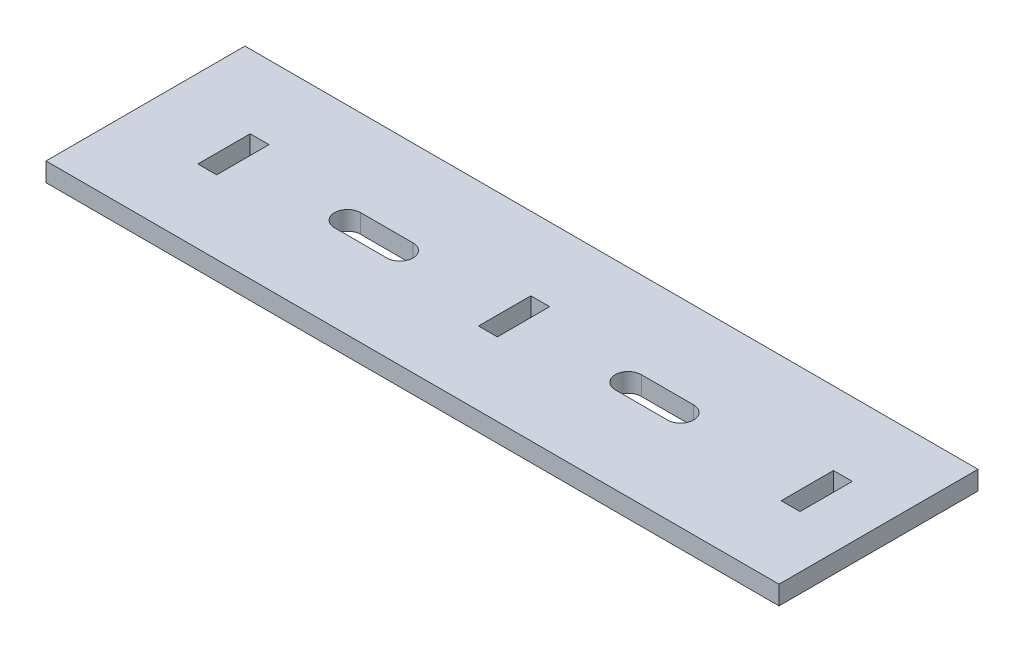
ISO-10303-21;
HEADER;
FILE_DESCRIPTION(('STEP AP214'),'2;1');
FILE_NAME('part.step','',(''),(''),'','','');
FILE_SCHEMA(('AUTOMOTIVE_DESIGN { 1 0 10303 214 1 1 1 1 }'));
ENDSEC;
DATA;
#1=APPLICATION_CONTEXT('core data for automotive mechanical design processes');
#2=APPLICATION_PROTOCOL_DEFINITION('international standard','automotive_design',2000,#1);
#3=PRODUCT_CONTEXT('',#1,'mechanical');
#4=PRODUCT('Part','Part','',(#3));
#5=PRODUCT_RELATED_PRODUCT_CATEGORY('part','',(#4));
#6=PRODUCT_DEFINITION_FORMATION('','',#4);
#7=PRODUCT_DEFINITION_CONTEXT('part definition',#1,'design');
#8=PRODUCT_DEFINITION('design','',#6,#7);
#9=PRODUCT_DEFINITION_SHAPE('','',#8);
#10=(LENGTH_UNIT() NAMED_UNIT(*) SI_UNIT(.MILLI.,.METRE.));
#11=(NAMED_UNIT(*) PLANE_ANGLE_UNIT() SI_UNIT($,.RADIAN.));
#12=(NAMED_UNIT(*) SI_UNIT($,.STERADIAN.) SOLID_ANGLE_UNIT());
#13=UNCERTAINTY_MEASURE_WITH_UNIT(LENGTH_MEASURE(1.E-05),#10,'distance_accuracy_value','');
#14=(GEOMETRIC_REPRESENTATION_CONTEXT(3) GLOBAL_UNCERTAINTY_ASSIGNED_CONTEXT((#13)) GLOBAL_UNIT_ASSIGNED_CONTEXT((#10,
#11,#12)) REPRESENTATION_CONTEXT('',''));
#15=CARTESIAN_POINT('',(0.,0.,0.));
#16=DIRECTION('',(0.,0.,1.));
#17=DIRECTION('',(1.,0.,0.));
#18=AXIS2_PLACEMENT_3D('',#15,#16,#17);
#19=CARTESIAN_POINT('',(0.,4.572,0.));
#20=DIRECTION('',(0.,-1.,0.));
#21=DIRECTION('',(0.,0.,-1.));
#22=AXIS2_PLACEMENT_3D('',#19,#20,#21);
#23=PLANE('',#22);
#24=DIRECTION('',(1.,0.,0.));
#25=VECTOR('',#24,1.);
#26=CARTESIAN_POINT('',(49.022,4.572,-20.955));
#27=LINE('',#26,#25);
#28=CARTESIAN_POINT('',(49.022,4.572,-20.955));
#29=VERTEX_POINT('',#28);
#30=CARTESIAN_POINT('',(61.722,4.572,-20.955));
#31=VERTEX_POINT('',#30);
#32=EDGE_CURVE('E223',#29,#31,#27,.T.);
#33=ORIENTED_EDGE('',*,*,#32,.F.);
#34=CARTESIAN_POINT('',(49.022,4.572,-24.13));
#35=DIRECTION('',(0.,1.,0.));
#36=DIRECTION('',(0.,0.,1.));
#37=AXIS2_PLACEMENT_3D('',#34,#35,#36);
#38=CIRCLE('',#37,3.175);
#39=CARTESIAN_POINT('',(49.022,4.572,-27.305));
#40=VERTEX_POINT('',#39);
#41=EDGE_CURVE('E60',#40,#29,#38,.T.);
#42=ORIENTED_EDGE('',*,*,#41,.F.);
#43=DIRECTION('',(-1.,0.,0.));
#44=VECTOR('',#43,1.);
#45=CARTESIAN_POINT('',(49.022,4.572,-27.305));
#46=LINE('',#45,#44);
#47=CARTESIAN_POINT('',(61.722,4.572,-27.305));
#48=VERTEX_POINT('',#47);
#49=EDGE_CURVE('E230',#48,#40,#46,.T.);
#50=ORIENTED_EDGE('',*,*,#49,.F.);
#51=CARTESIAN_POINT('',(61.722,4.572,-24.13));
#52=DIRECTION('',(0.,1.,0.));
#53=DIRECTION('',(0.,0.,1.));
#54=AXIS2_PLACEMENT_3D('',#51,#52,#53);
#55=CIRCLE('',#54,3.175);
#56=EDGE_CURVE('E212',#31,#48,#55,.T.);
#57=ORIENTED_EDGE('',*,*,#56,.F.);
#58=EDGE_LOOP('',(#33,#42,#50,#57));
#59=FACE_BOUND('',#58,.T.);
#60=DIRECTION('',(1.,0.,0.));
#61=VECTOR('',#60,1.);
#62=CARTESIAN_POINT('',(117.094,4.572,-20.955));
#63=LINE('',#62,#61);
#64=CARTESIAN_POINT('',(117.094,4.572,-20.955));
#65=VERTEX_POINT('',#64);
#66=CARTESIAN_POINT('',(129.794,4.572,-20.955));
#67=VERTEX_POINT('',#66);
#68=EDGE_CURVE('E265',#65,#67,#63,.T.);
#69=ORIENTED_EDGE('',*,*,#68,.F.);
#70=CARTESIAN_POINT('',(117.094,4.572,-24.13));
#71=DIRECTION('',(0.,1.,0.));
#72=DIRECTION('',(0.,0.,1.));
#73=AXIS2_PLACEMENT_3D('',#70,#71,#72);
#74=CIRCLE('',#73,3.175);
#75=CARTESIAN_POINT('',(117.094,4.572,-27.305));
#76=VERTEX_POINT('',#75);
#77=EDGE_CURVE('E68',#76,#65,#74,.T.);
#78=ORIENTED_EDGE('',*,*,#77,.F.);
#79=DIRECTION('',(-1.,0.,0.));
#80=VECTOR('',#79,1.);
#81=CARTESIAN_POINT('',(117.094,4.572,-27.305));
#82=LINE('',#81,#80);
#83=CARTESIAN_POINT('',(129.794000000001,4.572,-27.305));
#84=VERTEX_POINT('',#83);
#85=EDGE_CURVE('E248',#84,#76,#82,.T.);
#86=ORIENTED_EDGE('',*,*,#85,.F.);
#87=CARTESIAN_POINT('',(129.794,4.572,-24.13));
#88=DIRECTION('',(0.,1.,0.));
#89=DIRECTION('',(0.,0.,1.));
#90=AXIS2_PLACEMENT_3D('',#87,#88,#89);
#91=CIRCLE('',#90,3.175);
#92=EDGE_CURVE('E261',#67,#84,#91,.T.);
#93=ORIENTED_EDGE('',*,*,#92,.F.);
#94=EDGE_LOOP('',(#69,#78,#86,#93));
#95=FACE_BOUND('',#94,.T.);
#96=DIRECTION('',(0.,0.,-1.));
#97=VECTOR('',#96,1.);
#98=CARTESIAN_POINT('',(91.694,4.572,-17.78));
#99=LINE('',#98,#97);
#100=CARTESIAN_POINT('',(91.694,4.572,-17.78));
#101=VERTEX_POINT('',#100);
#102=CARTESIAN_POINT('',(91.694,4.572,-30.48));
#103=VERTEX_POINT('',#102);
#104=EDGE_CURVE('E314',#101,#103,#99,.T.);
#105=ORIENTED_EDGE('',*,*,#104,.F.);
#106=DIRECTION('',(1.,0.,0.));
#107=VECTOR('',#106,1.);
#108=CARTESIAN_POINT('',(91.694,4.572,-17.78));
#109=LINE('',#108,#107);
#110=CARTESIAN_POINT('',(87.122,4.572,-17.78));
#111=VERTEX_POINT('',#110);
#112=EDGE_CURVE('E325',#111,#101,#109,.T.);
#113=ORIENTED_EDGE('',*,*,#112,.F.);
#114=DIRECTION('',(0.,0.,1.));
#115=VECTOR('',#114,1.);
#116=CARTESIAN_POINT('',(87.122,4.572,-17.78));
#117=LINE('',#116,#115);
#118=CARTESIAN_POINT('',(87.122,4.572,-30.48));
#119=VERTEX_POINT('',#118);
#120=EDGE_CURVE('E321',#119,#111,#117,.T.);
#121=ORIENTED_EDGE('',*,*,#120,.F.);
#122=DIRECTION('',(-1.,0.,0.));
#123=VECTOR('',#122,1.);
#124=CARTESIAN_POINT('',(91.694,4.572,-30.48));
#125=LINE('',#124,#123);
#126=EDGE_CURVE('E317',#103,#119,#125,.T.);
#127=ORIENTED_EDGE('',*,*,#126,.F.);
#128=EDGE_LOOP('',(#105,#113,#121,#127));
#129=FACE_BOUND('',#128,.T.);
#130=DIRECTION('',(0.,0.,1.));
#131=VECTOR('',#130,1.);
#132=CARTESIAN_POINT('',(0.,4.572,0.));
#133=LINE('',#132,#131);
#134=CARTESIAN_POINT('',(0.,4.572,-48.26));
#135=VERTEX_POINT('',#134);
#136=CARTESIAN_POINT('',(0.,4.572,0.));
#137=VERTEX_POINT('',#136);
#138=EDGE_CURVE('E400',#135,#137,#133,.T.);
#139=ORIENTED_EDGE('',*,*,#138,.T.);
#140=DIRECTION('',(1.,0.,0.));
#141=VECTOR('',#140,1.);
#142=CARTESIAN_POINT('',(0.,4.572,0.));
#143=LINE('',#142,#141);
#144=CARTESIAN_POINT('',(177.8,4.572,0.));
#145=VERTEX_POINT('',#144);
#146=EDGE_CURVE('E404',#137,#145,#143,.T.);
#147=ORIENTED_EDGE('',*,*,#146,.T.);
#148=DIRECTION('',(0.,0.,-1.));
#149=VECTOR('',#148,1.);
#150=CARTESIAN_POINT('',(177.8,4.572,0.));
#151=LINE('',#150,#149);
#152=CARTESIAN_POINT('',(177.8,4.572,-48.26));
#153=VERTEX_POINT('',#152);
#154=EDGE_CURVE('E408',#145,#153,#151,.T.);
#155=ORIENTED_EDGE('',*,*,#154,.T.);
#156=DIRECTION('',(-1.,0.,0.));
#157=VECTOR('',#156,1.);
#158=CARTESIAN_POINT('',(0.,4.572,-48.26));
#159=LINE('',#158,#157);
#160=EDGE_CURVE('E411',#153,#135,#159,.T.);
#161=ORIENTED_EDGE('',*,*,#160,.T.);
#162=EDGE_LOOP('',(#139,#147,#155,#161));
#163=FACE_BOUND('',#162,.T.);
#164=DIRECTION('',(0.,0.,-1.));
#165=VECTOR('',#164,1.);
#166=CARTESIAN_POINT('',(165.1,4.572,-17.78));
#167=LINE('',#166,#165);
#168=CARTESIAN_POINT('',(165.1,4.572,-17.78));
#169=VERTEX_POINT('',#168);
#170=CARTESIAN_POINT('',(165.1,4.572,-30.48));
#171=VERTEX_POINT('',#170);
#172=EDGE_CURVE('E357',#169,#171,#167,.T.);
#173=ORIENTED_EDGE('',*,*,#172,.F.);
#174=DIRECTION('',(1.,0.,0.));
#175=VECTOR('',#174,1.);
#176=CARTESIAN_POINT('',(165.1,4.572,-17.78));
#177=LINE('',#176,#175);
#178=CARTESIAN_POINT('',(160.528,4.572,-17.78));
#179=VERTEX_POINT('',#178);
#180=EDGE_CURVE('E368',#179,#169,#177,.T.);
#181=ORIENTED_EDGE('',*,*,#180,.F.);
#182=DIRECTION('',(0.,0.,1.));
#183=VECTOR('',#182,1.);
#184=CARTESIAN_POINT('',(160.528,4.572,-17.78));
#185=LINE('',#184,#183);
#186=CARTESIAN_POINT('',(160.528,4.572,-30.48));
#187=VERTEX_POINT('',#186);
#188=EDGE_CURVE('E364',#187,#179,#185,.T.);
#189=ORIENTED_EDGE('',*,*,#188,.F.);
#190=DIRECTION('',(-1.,0.,0.));
#191=VECTOR('',#190,1.);
#192=CARTESIAN_POINT('',(165.1,4.572,-30.48));
#193=LINE('',#192,#191);
#194=EDGE_CURVE('E360',#171,#187,#193,.T.);
#195=ORIENTED_EDGE('',*,*,#194,.F.);
#196=EDGE_LOOP('',(#173,#181,#189,#195));
#197=FACE_BOUND('',#196,.T.);
#198=DIRECTION('',(0.,0.,-1.));
#199=VECTOR('',#198,1.);
#200=CARTESIAN_POINT('',(23.622,4.572,-17.78));
#201=LINE('',#200,#199);
#202=CARTESIAN_POINT('',(23.622,4.572,-17.78));
#203=VERTEX_POINT('',#202);
#204=CARTESIAN_POINT('',(23.622,4.572,-30.48));
#205=VERTEX_POINT('',#204);
#206=EDGE_CURVE('E271',#203,#205,#201,.T.);
#207=ORIENTED_EDGE('',*,*,#206,.F.);
#208=DIRECTION('',(1.,0.,0.));
#209=VECTOR('',#208,1.);
#210=CARTESIAN_POINT('',(23.622,4.572,-17.78));
#211=LINE('',#210,#209);
#212=CARTESIAN_POINT('',(19.05,4.572,-17.78));
#213=VERTEX_POINT('',#212);
#214=EDGE_CURVE('E282',#213,#203,#211,.T.);
#215=ORIENTED_EDGE('',*,*,#214,.F.);
#216=DIRECTION('',(0.,0.,1.));
#217=VECTOR('',#216,1.);
#218=CARTESIAN_POINT('',(19.05,4.572,-17.78));
#219=LINE('',#218,#217);
#220=CARTESIAN_POINT('',(19.05,4.572,-30.48));
#221=VERTEX_POINT('',#220);
#222=EDGE_CURVE('E278',#221,#213,#219,.T.);
#223=ORIENTED_EDGE('',*,*,#222,.F.);
#224=DIRECTION('',(-1.,0.,0.));
#225=VECTOR('',#224,1.);
#226=CARTESIAN_POINT('',(23.622,4.572,-30.48));
#227=LINE('',#226,#225);
#228=EDGE_CURVE('E274',#205,#221,#227,.T.);
#229=ORIENTED_EDGE('',*,*,#228,.F.);
#230=EDGE_LOOP('',(#207,#215,#223,#229));
#231=FACE_BOUND('',#230,.T.);
#232=ADVANCED_FACE('F44',(#59,#95,#129,#163,#197,#231),#23,.F.);
#233=CARTESIAN_POINT('',(0.,0.,0.));
#234=DIRECTION('',(0.,-1.,0.));
#235=DIRECTION('',(0.,0.,-1.));
#236=AXIS2_PLACEMENT_3D('',#233,#234,#235);
#237=PLANE('',#236);
#238=CARTESIAN_POINT('',(49.022,0.,-24.13));
#239=DIRECTION('',(0.,-1.,0.));
#240=DIRECTION('',(0.,0.,-1.));
#241=AXIS2_PLACEMENT_3D('',#238,#239,#240);
#242=CIRCLE('',#241,3.175);
#243=CARTESIAN_POINT('',(49.022,0.,-20.955));
#244=VERTEX_POINT('',#243);
#245=CARTESIAN_POINT('',(49.022,0.,-27.305));
#246=VERTEX_POINT('',#245);
#247=EDGE_CURVE('E11',#244,#246,#242,.T.);
#248=ORIENTED_EDGE('',*,*,#247,.F.);
#249=DIRECTION('',(-1.,0.,0.));
#250=VECTOR('',#249,1.);
#251=CARTESIAN_POINT('',(0.,0.,-20.955));
#252=LINE('',#251,#250);
#253=CARTESIAN_POINT('',(61.722,0.,-20.955));
#254=VERTEX_POINT('',#253);
#255=EDGE_CURVE('E454',#254,#244,#252,.T.);
#256=ORIENTED_EDGE('',*,*,#255,.F.);
#257=CARTESIAN_POINT('',(61.722,0.,-24.13));
#258=DIRECTION('',(0.,-1.,0.));
#259=DIRECTION('',(0.,0.,-1.));
#260=AXIS2_PLACEMENT_3D('',#257,#258,#259);
#261=CIRCLE('',#260,3.175);
#262=CARTESIAN_POINT('',(61.722,0.,-27.305));
#263=VERTEX_POINT('',#262);
#264=EDGE_CURVE('E215',#263,#254,#261,.T.);
#265=ORIENTED_EDGE('',*,*,#264,.F.);
#266=DIRECTION('',(1.,0.,0.));
#267=VECTOR('',#266,1.);
#268=CARTESIAN_POINT('',(0.,0.,-27.305));
#269=LINE('',#268,#267);
#270=EDGE_CURVE('E53',#246,#263,#269,.T.);
#271=ORIENTED_EDGE('',*,*,#270,.F.);
#272=EDGE_LOOP('',(#248,#256,#265,#271));
#273=FACE_BOUND('',#272,.T.);
#274=CARTESIAN_POINT('',(117.094,0.,-24.13));
#275=DIRECTION('',(0.,-1.,0.));
#276=DIRECTION('',(0.,0.,-1.));
#277=AXIS2_PLACEMENT_3D('',#274,#275,#276);
#278=CIRCLE('',#277,3.175);
#279=CARTESIAN_POINT('',(117.094,0.,-20.955));
#280=VERTEX_POINT('',#279);
#281=CARTESIAN_POINT('',(117.094,0.,-27.305));
#282=VERTEX_POINT('',#281);
#283=EDGE_CURVE('E451',#280,#282,#278,.T.);
#284=ORIENTED_EDGE('',*,*,#283,.F.);
#285=DIRECTION('',(-1.,0.,0.));
#286=VECTOR('',#285,1.);
#287=CARTESIAN_POINT('',(0.,0.,-20.955));
#288=LINE('',#287,#286);
#289=CARTESIAN_POINT('',(129.794,0.,-20.955));
#290=VERTEX_POINT('',#289);
#291=EDGE_CURVE('E441',#290,#280,#288,.T.);
#292=ORIENTED_EDGE('',*,*,#291,.F.);
#293=CARTESIAN_POINT('',(129.794,0.,-24.13));
#294=DIRECTION('',(0.,-1.,0.));
#295=DIRECTION('',(0.,0.,-1.));
#296=AXIS2_PLACEMENT_3D('',#293,#294,#295);
#297=CIRCLE('',#296,3.175);
#298=CARTESIAN_POINT('',(129.794000000001,0.,-27.305));
#299=VERTEX_POINT('',#298);
#300=EDGE_CURVE('E444',#299,#290,#297,.T.);
#301=ORIENTED_EDGE('',*,*,#300,.F.);
#302=DIRECTION('',(1.,0.,0.));
#303=VECTOR('',#302,1.);
#304=CARTESIAN_POINT('',(0.,0.,-27.305));
#305=LINE('',#304,#303);
#306=EDGE_CURVE('E448',#282,#299,#305,.T.);
#307=ORIENTED_EDGE('',*,*,#306,.F.);
#308=EDGE_LOOP('',(#284,#292,#301,#307));
#309=FACE_BOUND('',#308,.T.);
#310=DIRECTION('',(0.,0.,1.));
#311=VECTOR('',#310,1.);
#312=CARTESIAN_POINT('',(0.,0.,0.));
#313=LINE('',#312,#311);
#314=CARTESIAN_POINT('',(0.,0.,-48.26));
#315=VERTEX_POINT('',#314);
#316=CARTESIAN_POINT('',(0.,0.,0.));
#317=VERTEX_POINT('',#316);
#318=EDGE_CURVE('E399',#315,#317,#313,.T.);
#319=ORIENTED_EDGE('',*,*,#318,.F.);
#320=DIRECTION('',(-1.,0.,0.));
#321=VECTOR('',#320,1.);
#322=CARTESIAN_POINT('',(0.,0.,-48.26));
#323=LINE('',#322,#321);
#324=CARTESIAN_POINT('',(177.8,0.,-48.26));
#325=VERTEX_POINT('',#324);
#326=EDGE_CURVE('E405',#325,#315,#323,.T.);
#327=ORIENTED_EDGE('',*,*,#326,.F.);
#328=DIRECTION('',(0.,0.,-1.));
#329=VECTOR('',#328,1.);
#330=CARTESIAN_POINT('',(177.8,0.,0.));
#331=LINE('',#330,#329);
#332=CARTESIAN_POINT('',(177.8,0.,0.));
#333=VERTEX_POINT('',#332);
#334=EDGE_CURVE('E421',#333,#325,#331,.T.);
#335=ORIENTED_EDGE('',*,*,#334,.F.);
#336=DIRECTION('',(1.,0.,0.));
#337=VECTOR('',#336,1.);
#338=CARTESIAN_POINT('',(0.,0.,0.));
#339=LINE('',#338,#337);
#340=EDGE_CURVE('E418',#317,#333,#339,.T.);
#341=ORIENTED_EDGE('',*,*,#340,.F.);
#342=EDGE_LOOP('',(#319,#327,#335,#341));
#343=FACE_BOUND('',#342,.T.);
#344=DIRECTION('',(1.,0.,0.));
#345=VECTOR('',#344,1.);
#346=CARTESIAN_POINT('',(165.1,0.,-17.78));
#347=LINE('',#346,#345);
#348=CARTESIAN_POINT('',(160.528,0.,-17.78));
#349=VERTEX_POINT('',#348);
#350=CARTESIAN_POINT('',(165.1,0.,-17.78));
#351=VERTEX_POINT('',#350);
#352=EDGE_CURVE('E361',#349,#351,#347,.T.);
#353=ORIENTED_EDGE('',*,*,#352,.T.);
#354=DIRECTION('',(0.,0.,-1.));
#355=VECTOR('',#354,1.);
#356=CARTESIAN_POINT('',(165.1,0.,-17.78));
#357=LINE('',#356,#355);
#358=CARTESIAN_POINT('',(165.1,0.,-30.48));
#359=VERTEX_POINT('',#358);
#360=EDGE_CURVE('E356',#351,#359,#357,.T.);
#361=ORIENTED_EDGE('',*,*,#360,.T.);
#362=DIRECTION('',(-1.,0.,0.));
#363=VECTOR('',#362,1.);
#364=CARTESIAN_POINT('',(165.1,0.,-30.48));
#365=LINE('',#364,#363);
#366=CARTESIAN_POINT('',(160.528,0.,-30.48));
#367=VERTEX_POINT('',#366);
#368=EDGE_CURVE('E375',#359,#367,#365,.T.);
#369=ORIENTED_EDGE('',*,*,#368,.T.);
#370=DIRECTION('',(0.,0.,1.));
#371=VECTOR('',#370,1.);
#372=CARTESIAN_POINT('',(160.528,0.,-17.78));
#373=LINE('',#372,#371);
#374=EDGE_CURVE('E379',#367,#349,#373,.T.);
#375=ORIENTED_EDGE('',*,*,#374,.T.);
#376=EDGE_LOOP('',(#353,#361,#369,#375));
#377=FACE_BOUND('',#376,.T.);
#378=DIRECTION('',(1.,0.,0.));
#379=VECTOR('',#378,1.);
#380=CARTESIAN_POINT('',(91.694,0.,-17.78));
#381=LINE('',#380,#379);
#382=CARTESIAN_POINT('',(87.122,0.,-17.78));
#383=VERTEX_POINT('',#382);
#384=CARTESIAN_POINT('',(91.694,0.,-17.78));
#385=VERTEX_POINT('',#384);
#386=EDGE_CURVE('E318',#383,#385,#381,.T.);
#387=ORIENTED_EDGE('',*,*,#386,.T.);
#388=DIRECTION('',(0.,0.,-1.));
#389=VECTOR('',#388,1.);
#390=CARTESIAN_POINT('',(91.694,0.,-17.78));
#391=LINE('',#390,#389);
#392=CARTESIAN_POINT('',(91.694,0.,-30.48));
#393=VERTEX_POINT('',#392);
#394=EDGE_CURVE('E313',#385,#393,#391,.T.);
#395=ORIENTED_EDGE('',*,*,#394,.T.);
#396=DIRECTION('',(-1.,0.,0.));
#397=VECTOR('',#396,1.);
#398=CARTESIAN_POINT('',(91.694,0.,-30.48));
#399=LINE('',#398,#397);
#400=CARTESIAN_POINT('',(87.122,0.,-30.48));
#401=VERTEX_POINT('',#400);
#402=EDGE_CURVE('E332',#393,#401,#399,.T.);
#403=ORIENTED_EDGE('',*,*,#402,.T.);
#404=DIRECTION('',(0.,0.,1.));
#405=VECTOR('',#404,1.);
#406=CARTESIAN_POINT('',(87.122,0.,-17.78));
#407=LINE('',#406,#405);
#408=EDGE_CURVE('E336',#401,#383,#407,.T.);
#409=ORIENTED_EDGE('',*,*,#408,.T.);
#410=EDGE_LOOP('',(#387,#395,#403,#409));
#411=FACE_BOUND('',#410,.T.);
#412=DIRECTION('',(1.,0.,0.));
#413=VECTOR('',#412,1.);
#414=CARTESIAN_POINT('',(23.622,0.,-17.78));
#415=LINE('',#414,#413);
#416=CARTESIAN_POINT('',(19.05,0.,-17.78));
#417=VERTEX_POINT('',#416);
#418=CARTESIAN_POINT('',(23.622,0.,-17.78));
#419=VERTEX_POINT('',#418);
#420=EDGE_CURVE('E275',#417,#419,#415,.T.);
#421=ORIENTED_EDGE('',*,*,#420,.T.);
#422=DIRECTION('',(0.,0.,-1.));
#423=VECTOR('',#422,1.);
#424=CARTESIAN_POINT('',(23.622,0.,-17.78));
#425=LINE('',#424,#423);
#426=CARTESIAN_POINT('',(23.622,0.,-30.48));
#427=VERTEX_POINT('',#426);
#428=EDGE_CURVE('E240',#419,#427,#425,.T.);
#429=ORIENTED_EDGE('',*,*,#428,.T.);
#430=DIRECTION('',(-1.,0.,0.));
#431=VECTOR('',#430,1.);
#432=CARTESIAN_POINT('',(23.622,0.,-30.48));
#433=LINE('',#432,#431);
#434=CARTESIAN_POINT('',(19.05,0.,-30.48));
#435=VERTEX_POINT('',#434);
#436=EDGE_CURVE('E289',#427,#435,#433,.T.);
#437=ORIENTED_EDGE('',*,*,#436,.T.);
#438=DIRECTION('',(0.,0.,1.));
#439=VECTOR('',#438,1.);
#440=CARTESIAN_POINT('',(19.05,0.,-17.78));
#441=LINE('',#440,#439);
#442=EDGE_CURVE('E293',#435,#417,#441,.T.);
#443=ORIENTED_EDGE('',*,*,#442,.T.);
#444=EDGE_LOOP('',(#421,#429,#437,#443));
#445=FACE_BOUND('',#444,.T.);
#446=ADVANCED_FACE('F465',(#273,#309,#343,#377,#411,#445),#237,.T.);
#447=CARTESIAN_POINT('',(0.,4.572,0.));
#448=DIRECTION('',(1.,0.,0.));
#449=DIRECTION('',(0.,0.,-1.));
#450=AXIS2_PLACEMENT_3D('',#447,#448,#449);
#451=PLANE('',#450);
#452=ORIENTED_EDGE('',*,*,#318,.T.);
#453=DIRECTION('',(0.,-1.,0.));
#454=VECTOR('',#453,1.);
#455=CARTESIAN_POINT('',(0.,4.572,0.));
#456=LINE('',#455,#454);
#457=EDGE_CURVE('E437',#137,#317,#456,.T.);
#458=ORIENTED_EDGE('',*,*,#457,.F.);
#459=ORIENTED_EDGE('',*,*,#138,.F.);
#460=DIRECTION('',(0.,-1.,0.));
#461=VECTOR('',#460,1.);
#462=CARTESIAN_POINT('',(0.,4.572,-48.26));
#463=LINE('',#462,#461);
#464=EDGE_CURVE('E414',#135,#315,#463,.T.);
#465=ORIENTED_EDGE('',*,*,#464,.T.);
#466=EDGE_LOOP('',(#452,#458,#459,#465));
#467=FACE_BOUND('',#466,.T.);
#468=ADVANCED_FACE('F46',(#467),#451,.F.);
#469=CARTESIAN_POINT('',(0.,4.572,0.));
#470=DIRECTION('',(0.,0.,-1.));
#471=DIRECTION('',(-1.,0.,0.));
#472=AXIS2_PLACEMENT_3D('',#469,#470,#471);
#473=PLANE('',#472);
#474=ORIENTED_EDGE('',*,*,#340,.T.);
#475=DIRECTION('',(0.,-1.,0.));
#476=VECTOR('',#475,1.);
#477=CARTESIAN_POINT('',(177.8,4.572,0.));
#478=LINE('',#477,#476);
#479=EDGE_CURVE('E433',#145,#333,#478,.T.);
#480=ORIENTED_EDGE('',*,*,#479,.F.);
#481=ORIENTED_EDGE('',*,*,#146,.F.);
#482=ORIENTED_EDGE('',*,*,#457,.T.);
#483=EDGE_LOOP('',(#474,#480,#481,#482));
#484=FACE_BOUND('',#483,.T.);
#485=ADVANCED_FACE('F499',(#484),#473,.F.);
#486=CARTESIAN_POINT('',(177.8,4.572,0.));
#487=DIRECTION('',(-1.,0.,0.));
#488=DIRECTION('',(0.,0.,1.));
#489=AXIS2_PLACEMENT_3D('',#486,#487,#488);
#490=PLANE('',#489);
#491=ORIENTED_EDGE('',*,*,#334,.T.);
#492=DIRECTION('',(0.,-1.,0.));
#493=VECTOR('',#492,1.);
#494=CARTESIAN_POINT('',(177.8,4.572,-48.26));
#495=LINE('',#494,#493);
#496=EDGE_CURVE('E429',#153,#325,#495,.T.);
#497=ORIENTED_EDGE('',*,*,#496,.F.);
#498=ORIENTED_EDGE('',*,*,#154,.F.);
#499=ORIENTED_EDGE('',*,*,#479,.T.);
#500=EDGE_LOOP('',(#491,#497,#498,#499));
#501=FACE_BOUND('',#500,.T.);
#502=ADVANCED_FACE('F496',(#501),#490,.F.);
#503=CARTESIAN_POINT('',(0.,4.572,-48.26));
#504=DIRECTION('',(0.,0.,1.));
#505=DIRECTION('',(1.,0.,0.));
#506=AXIS2_PLACEMENT_3D('',#503,#504,#505);
#507=PLANE('',#506);
#508=ORIENTED_EDGE('',*,*,#326,.T.);
#509=ORIENTED_EDGE('',*,*,#464,.F.);
#510=ORIENTED_EDGE('',*,*,#160,.F.);
#511=ORIENTED_EDGE('',*,*,#496,.T.);
#512=EDGE_LOOP('',(#508,#509,#510,#511));
#513=FACE_BOUND('',#512,.T.);
#514=ADVANCED_FACE('F493',(#513),#507,.F.);
#515=CARTESIAN_POINT('',(165.1,4.572,-17.78));
#516=DIRECTION('',(-1.,0.,0.));
#517=DIRECTION('',(0.,0.,1.));
#518=AXIS2_PLACEMENT_3D('',#515,#516,#517);
#519=PLANE('',#518);
#520=ORIENTED_EDGE('',*,*,#360,.F.);
#521=DIRECTION('',(0.,-1.,0.));
#522=VECTOR('',#521,1.);
#523=CARTESIAN_POINT('',(165.1,4.572,-17.78));
#524=LINE('',#523,#522);
#525=EDGE_CURVE('E371',#169,#351,#524,.T.);
#526=ORIENTED_EDGE('',*,*,#525,.F.);
#527=ORIENTED_EDGE('',*,*,#172,.T.);
#528=DIRECTION('',(0.,-1.,0.));
#529=VECTOR('',#528,1.);
#530=CARTESIAN_POINT('',(165.1,4.572,-30.48));
#531=LINE('',#530,#529);
#532=EDGE_CURVE('E395',#171,#359,#531,.T.);
#533=ORIENTED_EDGE('',*,*,#532,.T.);
#534=EDGE_LOOP('',(#520,#526,#527,#533));
#535=FACE_BOUND('',#534,.T.);
#536=ADVANCED_FACE('F490',(#535),#519,.T.);
#537=CARTESIAN_POINT('',(165.1,4.572,-30.48));
#538=DIRECTION('',(0.,0.,1.));
#539=DIRECTION('',(1.,0.,0.));
#540=AXIS2_PLACEMENT_3D('',#537,#538,#539);
#541=PLANE('',#540);
#542=ORIENTED_EDGE('',*,*,#368,.F.);
#543=ORIENTED_EDGE('',*,*,#532,.F.);
#544=ORIENTED_EDGE('',*,*,#194,.T.);
#545=DIRECTION('',(0.,-1.,0.));
#546=VECTOR('',#545,1.);
#547=CARTESIAN_POINT('',(160.528,4.572,-30.48));
#548=LINE('',#547,#546);
#549=EDGE_CURVE('E392',#187,#367,#548,.T.);
#550=ORIENTED_EDGE('',*,*,#549,.T.);
#551=EDGE_LOOP('',(#542,#543,#544,#550));
#552=FACE_BOUND('',#551,.T.);
#553=ADVANCED_FACE('F577',(#552),#541,.T.);
#554=CARTESIAN_POINT('',(160.528,4.572,-17.78));
#555=DIRECTION('',(1.,0.,0.));
#556=DIRECTION('',(0.,0.,-1.));
#557=AXIS2_PLACEMENT_3D('',#554,#555,#556);
#558=PLANE('',#557);
#559=ORIENTED_EDGE('',*,*,#374,.F.);
#560=ORIENTED_EDGE('',*,*,#549,.F.);
#561=ORIENTED_EDGE('',*,*,#188,.T.);
#562=DIRECTION('',(0.,-1.,0.));
#563=VECTOR('',#562,1.);
#564=CARTESIAN_POINT('',(160.528,4.572,-17.78));
#565=LINE('',#564,#563);
#566=EDGE_CURVE('E389',#179,#349,#565,.T.);
#567=ORIENTED_EDGE('',*,*,#566,.T.);
#568=EDGE_LOOP('',(#559,#560,#561,#567));
#569=FACE_BOUND('',#568,.T.);
#570=ADVANCED_FACE('F574',(#569),#558,.T.);
#571=CARTESIAN_POINT('',(165.1,4.572,-17.78));
#572=DIRECTION('',(0.,0.,-1.));
#573=DIRECTION('',(-1.,0.,0.));
#574=AXIS2_PLACEMENT_3D('',#571,#572,#573);
#575=PLANE('',#574);
#576=ORIENTED_EDGE('',*,*,#352,.F.);
#577=ORIENTED_EDGE('',*,*,#566,.F.);
#578=ORIENTED_EDGE('',*,*,#180,.T.);
#579=ORIENTED_EDGE('',*,*,#525,.T.);
#580=EDGE_LOOP('',(#576,#577,#578,#579));
#581=FACE_BOUND('',#580,.T.);
#582=ADVANCED_FACE('F570',(#581),#575,.T.);
#583=CARTESIAN_POINT('',(91.694,4.572,-17.78));
#584=DIRECTION('',(-1.,0.,0.));
#585=DIRECTION('',(0.,0.,1.));
#586=AXIS2_PLACEMENT_3D('',#583,#584,#585);
#587=PLANE('',#586);
#588=ORIENTED_EDGE('',*,*,#394,.F.);
#589=DIRECTION('',(0.,-1.,0.));
#590=VECTOR('',#589,1.);
#591=CARTESIAN_POINT('',(91.694,4.572,-17.78));
#592=LINE('',#591,#590);
#593=EDGE_CURVE('E328',#101,#385,#592,.T.);
#594=ORIENTED_EDGE('',*,*,#593,.F.);
#595=ORIENTED_EDGE('',*,*,#104,.T.);
#596=DIRECTION('',(0.,-1.,0.));
#597=VECTOR('',#596,1.);
#598=CARTESIAN_POINT('',(91.694,4.572,-30.48));
#599=LINE('',#598,#597);
#600=EDGE_CURVE('E352',#103,#393,#599,.T.);
#601=ORIENTED_EDGE('',*,*,#600,.T.);
#602=EDGE_LOOP('',(#588,#594,#595,#601));
#603=FACE_BOUND('',#602,.T.);
#604=ADVANCED_FACE('F566',(#603),#587,.T.);
#605=CARTESIAN_POINT('',(91.694,4.572,-30.48));
#606=DIRECTION('',(0.,0.,1.));
#607=DIRECTION('',(1.,0.,0.));
#608=AXIS2_PLACEMENT_3D('',#605,#606,#607);
#609=PLANE('',#608);
#610=ORIENTED_EDGE('',*,*,#402,.F.);
#611=ORIENTED_EDGE('',*,*,#600,.F.);
#612=ORIENTED_EDGE('',*,*,#126,.T.);
#613=DIRECTION('',(0.,-1.,0.));
#614=VECTOR('',#613,1.);
#615=CARTESIAN_POINT('',(87.122,4.572,-30.48));
#616=LINE('',#615,#614);
#617=EDGE_CURVE('E349',#119,#401,#616,.T.);
#618=ORIENTED_EDGE('',*,*,#617,.T.);
#619=EDGE_LOOP('',(#610,#611,#612,#618));
#620=FACE_BOUND('',#619,.T.);
#621=ADVANCED_FACE('F562',(#620),#609,.T.);
#622=CARTESIAN_POINT('',(87.122,4.572,-17.78));
#623=DIRECTION('',(1.,0.,0.));
#624=DIRECTION('',(0.,0.,-1.));
#625=AXIS2_PLACEMENT_3D('',#622,#623,#624);
#626=PLANE('',#625);
#627=ORIENTED_EDGE('',*,*,#408,.F.);
#628=ORIENTED_EDGE('',*,*,#617,.F.);
#629=ORIENTED_EDGE('',*,*,#120,.T.);
#630=DIRECTION('',(0.,-1.,0.));
#631=VECTOR('',#630,1.);
#632=CARTESIAN_POINT('',(87.122,4.572,-17.78));
#633=LINE('',#632,#631);
#634=EDGE_CURVE('E346',#111,#383,#633,.T.);
#635=ORIENTED_EDGE('',*,*,#634,.T.);
#636=EDGE_LOOP('',(#627,#628,#629,#635));
#637=FACE_BOUND('',#636,.T.);
#638=ADVANCED_FACE('F558',(#637),#626,.T.);
#639=CARTESIAN_POINT('',(91.694,4.572,-17.78));
#640=DIRECTION('',(0.,0.,-1.));
#641=DIRECTION('',(-1.,0.,0.));
#642=AXIS2_PLACEMENT_3D('',#639,#640,#641);
#643=PLANE('',#642);
#644=ORIENTED_EDGE('',*,*,#386,.F.);
#645=ORIENTED_EDGE('',*,*,#634,.F.);
#646=ORIENTED_EDGE('',*,*,#112,.T.);
#647=ORIENTED_EDGE('',*,*,#593,.T.);
#648=EDGE_LOOP('',(#644,#645,#646,#647));
#649=FACE_BOUND('',#648,.T.);
#650=ADVANCED_FACE('F555',(#649),#643,.T.);
#651=CARTESIAN_POINT('',(23.622,4.572,-17.78));
#652=DIRECTION('',(-1.,0.,0.));
#653=DIRECTION('',(0.,0.,1.));
#654=AXIS2_PLACEMENT_3D('',#651,#652,#653);
#655=PLANE('',#654);
#656=ORIENTED_EDGE('',*,*,#428,.F.);
#657=DIRECTION('',(0.,-1.,0.));
#658=VECTOR('',#657,1.);
#659=CARTESIAN_POINT('',(23.622,4.572,-17.78));
#660=LINE('',#659,#658);
#661=EDGE_CURVE('E285',#203,#419,#660,.T.);
#662=ORIENTED_EDGE('',*,*,#661,.F.);
#663=ORIENTED_EDGE('',*,*,#206,.T.);
#664=DIRECTION('',(0.,-1.,0.));
#665=VECTOR('',#664,1.);
#666=CARTESIAN_POINT('',(23.622,4.572,-30.48));
#667=LINE('',#666,#665);
#668=EDGE_CURVE('E309',#205,#427,#667,.T.);
#669=ORIENTED_EDGE('',*,*,#668,.T.);
#670=EDGE_LOOP('',(#656,#662,#663,#669));
#671=FACE_BOUND('',#670,.T.);
#672=ADVANCED_FACE('F532',(#671),#655,.T.);
#673=CARTESIAN_POINT('',(23.622,4.572,-30.48));
#674=DIRECTION('',(0.,0.,1.));
#675=DIRECTION('',(1.,0.,0.));
#676=AXIS2_PLACEMENT_3D('',#673,#674,#675);
#677=PLANE('',#676);
#678=ORIENTED_EDGE('',*,*,#436,.F.);
#679=ORIENTED_EDGE('',*,*,#668,.F.);
#680=ORIENTED_EDGE('',*,*,#228,.T.);
#681=DIRECTION('',(0.,-1.,0.));
#682=VECTOR('',#681,1.);
#683=CARTESIAN_POINT('',(19.05,4.572,-30.48));
#684=LINE('',#683,#682);
#685=EDGE_CURVE('E306',#221,#435,#684,.T.);
#686=ORIENTED_EDGE('',*,*,#685,.T.);
#687=EDGE_LOOP('',(#678,#679,#680,#686));
#688=FACE_BOUND('',#687,.T.);
#689=ADVANCED_FACE('F534',(#688),#677,.T.);
#690=CARTESIAN_POINT('',(19.05,4.572,-17.78));
#691=DIRECTION('',(1.,0.,0.));
#692=DIRECTION('',(0.,0.,-1.));
#693=AXIS2_PLACEMENT_3D('',#690,#691,#692);
#694=PLANE('',#693);
#695=ORIENTED_EDGE('',*,*,#442,.F.);
#696=ORIENTED_EDGE('',*,*,#685,.F.);
#697=ORIENTED_EDGE('',*,*,#222,.T.);
#698=DIRECTION('',(0.,-1.,0.));
#699=VECTOR('',#698,1.);
#700=CARTESIAN_POINT('',(19.05,4.572,-17.78));
#701=LINE('',#700,#699);
#702=EDGE_CURVE('E303',#213,#417,#701,.T.);
#703=ORIENTED_EDGE('',*,*,#702,.T.);
#704=EDGE_LOOP('',(#695,#696,#697,#703));
#705=FACE_BOUND('',#704,.T.);
#706=ADVANCED_FACE('F542',(#705),#694,.T.);
#707=CARTESIAN_POINT('',(23.622,4.572,-17.78));
#708=DIRECTION('',(0.,0.,-1.));
#709=DIRECTION('',(-1.,0.,0.));
#710=AXIS2_PLACEMENT_3D('',#707,#708,#709);
#711=PLANE('',#710);
#712=ORIENTED_EDGE('',*,*,#420,.F.);
#713=ORIENTED_EDGE('',*,*,#702,.F.);
#714=ORIENTED_EDGE('',*,*,#214,.T.);
#715=ORIENTED_EDGE('',*,*,#661,.T.);
#716=EDGE_LOOP('',(#712,#713,#714,#715));
#717=FACE_BOUND('',#716,.T.);
#718=ADVANCED_FACE('F540',(#717),#711,.T.);
#719=CARTESIAN_POINT('',(117.094,-0.508000000000001,-24.13));
#720=DIRECTION('',(0.,1.,0.));
#721=DIRECTION('',(0.,0.,1.));
#722=AXIS2_PLACEMENT_3D('',#719,#720,#721);
#723=CYLINDRICAL_SURFACE('',#722,3.175);
#724=ORIENTED_EDGE('',*,*,#283,.T.);
#725=DIRECTION('',(0.,1.,0.));
#726=VECTOR('',#725,1.);
#727=CARTESIAN_POINT('',(117.094,-0.508000000000001,-27.305));
#728=LINE('',#727,#726);
#729=EDGE_CURVE('E255',#282,#76,#728,.T.);
#730=ORIENTED_EDGE('',*,*,#729,.T.);
#731=ORIENTED_EDGE('',*,*,#77,.T.);
#732=DIRECTION('',(0.,1.,0.));
#733=VECTOR('',#732,1.);
#734=CARTESIAN_POINT('',(117.094,-0.508000000000001,-20.955));
#735=LINE('',#734,#733);
#736=EDGE_CURVE('E245',#280,#65,#735,.T.);
#737=ORIENTED_EDGE('',*,*,#736,.F.);
#738=EDGE_LOOP('',(#724,#730,#731,#737));
#739=FACE_BOUND('',#738,.T.);
#740=ADVANCED_FACE('F548',(#739),#723,.F.);
#741=CARTESIAN_POINT('',(117.094,-0.508000000000001,-27.305));
#742=DIRECTION('',(0.,0.,-1.));
#743=DIRECTION('',(-1.,0.,0.));
#744=AXIS2_PLACEMENT_3D('',#741,#742,#743);
#745=PLANE('',#744);
#746=ORIENTED_EDGE('',*,*,#306,.T.);
#747=DIRECTION('',(0.,1.,0.));
#748=VECTOR('',#747,1.);
#749=CARTESIAN_POINT('',(129.794000000001,-0.508000000000001,-27.305));
#750=LINE('',#749,#748);
#751=EDGE_CURVE('E252',#299,#84,#750,.T.);
#752=ORIENTED_EDGE('',*,*,#751,.T.);
#753=ORIENTED_EDGE('',*,*,#85,.T.);
#754=ORIENTED_EDGE('',*,*,#729,.F.);
#755=EDGE_LOOP('',(#746,#752,#753,#754));
#756=FACE_BOUND('',#755,.T.);
#757=ADVANCED_FACE('F642',(#756),#745,.F.);
#758=CARTESIAN_POINT('',(129.794,-0.508000000000001,-24.13));
#759=DIRECTION('',(0.,1.,0.));
#760=DIRECTION('',(0.,0.,1.));
#761=AXIS2_PLACEMENT_3D('',#758,#759,#760);
#762=CYLINDRICAL_SURFACE('',#761,3.175);
#763=ORIENTED_EDGE('',*,*,#300,.T.);
#764=DIRECTION('',(0.,1.,0.));
#765=VECTOR('',#764,1.);
#766=CARTESIAN_POINT('',(129.794,-0.508000000000001,-20.955));
#767=LINE('',#766,#765);
#768=EDGE_CURVE('E249',#290,#67,#767,.T.);
#769=ORIENTED_EDGE('',*,*,#768,.T.);
#770=ORIENTED_EDGE('',*,*,#92,.T.);
#771=ORIENTED_EDGE('',*,*,#751,.F.);
#772=EDGE_LOOP('',(#763,#769,#770,#771));
#773=FACE_BOUND('',#772,.T.);
#774=ADVANCED_FACE('F477',(#773),#762,.F.);
#775=CARTESIAN_POINT('',(117.094,-0.508000000000001,-20.955));
#776=DIRECTION('',(0.,0.,1.));
#777=DIRECTION('',(1.,0.,0.));
#778=AXIS2_PLACEMENT_3D('',#775,#776,#777);
#779=PLANE('',#778);
#780=ORIENTED_EDGE('',*,*,#291,.T.);
#781=ORIENTED_EDGE('',*,*,#736,.T.);
#782=ORIENTED_EDGE('',*,*,#68,.T.);
#783=ORIENTED_EDGE('',*,*,#768,.F.);
#784=EDGE_LOOP('',(#780,#781,#782,#783));
#785=FACE_BOUND('',#784,.T.);
#786=ADVANCED_FACE('F470',(#785),#779,.F.);
#787=CARTESIAN_POINT('',(49.022,-0.508000000000001,-24.13));
#788=DIRECTION('',(0.,1.,0.));
#789=DIRECTION('',(0.,0.,1.));
#790=AXIS2_PLACEMENT_3D('',#787,#788,#789);
#791=CYLINDRICAL_SURFACE('',#790,3.175);
#792=ORIENTED_EDGE('',*,*,#247,.T.);
#793=DIRECTION('',(0.,1.,0.));
#794=VECTOR('',#793,1.);
#795=CARTESIAN_POINT('',(49.022,-0.508000000000001,-27.305));
#796=LINE('',#795,#794);
#797=EDGE_CURVE('E237',#246,#40,#796,.T.);
#798=ORIENTED_EDGE('',*,*,#797,.T.);
#799=ORIENTED_EDGE('',*,*,#41,.T.);
#800=DIRECTION('',(0.,1.,0.));
#801=VECTOR('',#800,1.);
#802=CARTESIAN_POINT('',(49.022,-0.508000000000001,-20.955));
#803=LINE('',#802,#801);
#804=EDGE_CURVE('E220',#244,#29,#803,.T.);
#805=ORIENTED_EDGE('',*,*,#804,.F.);
#806=EDGE_LOOP('',(#792,#798,#799,#805));
#807=FACE_BOUND('',#806,.T.);
#808=ADVANCED_FACE('F467',(#807),#791,.F.);
#809=CARTESIAN_POINT('',(49.022,-0.508000000000001,-27.305));
#810=DIRECTION('',(0.,0.,-1.));
#811=DIRECTION('',(-1.,0.,0.));
#812=AXIS2_PLACEMENT_3D('',#809,#810,#811);
#813=PLANE('',#812);
#814=ORIENTED_EDGE('',*,*,#270,.T.);
#815=DIRECTION('',(0.,1.,0.));
#816=VECTOR('',#815,1.);
#817=CARTESIAN_POINT('',(61.722,-0.508000000000001,-27.305));
#818=LINE('',#817,#816);
#819=EDGE_CURVE('E219',#263,#48,#818,.T.);
#820=ORIENTED_EDGE('',*,*,#819,.T.);
#821=ORIENTED_EDGE('',*,*,#49,.T.);
#822=ORIENTED_EDGE('',*,*,#797,.F.);
#823=EDGE_LOOP('',(#814,#820,#821,#822));
#824=FACE_BOUND('',#823,.T.);
#825=ADVANCED_FACE('F462',(#824),#813,.F.);
#826=CARTESIAN_POINT('',(61.722,-0.508000000000001,-24.13));
#827=DIRECTION('',(0.,1.,0.));
#828=DIRECTION('',(0.,0.,1.));
#829=AXIS2_PLACEMENT_3D('',#826,#827,#828);
#830=CYLINDRICAL_SURFACE('',#829,3.175);
#831=ORIENTED_EDGE('',*,*,#264,.T.);
#832=DIRECTION('',(0.,1.,0.));
#833=VECTOR('',#832,1.);
#834=CARTESIAN_POINT('',(61.722,-0.508000000000001,-20.955));
#835=LINE('',#834,#833);
#836=EDGE_CURVE('E207',#254,#31,#835,.T.);
#837=ORIENTED_EDGE('',*,*,#836,.T.);
#838=ORIENTED_EDGE('',*,*,#56,.T.);
#839=ORIENTED_EDGE('',*,*,#819,.F.);
#840=EDGE_LOOP('',(#831,#837,#838,#839));
#841=FACE_BOUND('',#840,.T.);
#842=ADVANCED_FACE('F209',(#841),#830,.F.);
#843=CARTESIAN_POINT('',(49.022,-0.508000000000001,-20.955));
#844=DIRECTION('',(0.,0.,1.));
#845=DIRECTION('',(1.,0.,0.));
#846=AXIS2_PLACEMENT_3D('',#843,#844,#845);
#847=PLANE('',#846);
#848=ORIENTED_EDGE('',*,*,#255,.T.);
#849=ORIENTED_EDGE('',*,*,#804,.T.);
#850=ORIENTED_EDGE('',*,*,#32,.T.);
#851=ORIENTED_EDGE('',*,*,#836,.F.);
#852=EDGE_LOOP('',(#848,#849,#850,#851));
#853=FACE_BOUND('',#852,.T.);
#854=ADVANCED_FACE('F224',(#853),#847,.F.);
#855=CLOSED_SHELL('',(#232,#446,#468,#485,#502,#514,#536,#553,#570,#582,#604,#621,#638,#650,
#672,#689,#706,#718,#740,#757,#774,#786,#808,#825,#842,#854));
#856=MANIFOLD_SOLID_BREP('B2',#855);
#857=ADVANCED_BREP_SHAPE_REPRESENTATION('',(#18,#856),#14);
#858=SHAPE_DEFINITION_REPRESENTATION(#9,#857);
ENDSEC;
END-ISO-10303-21;
